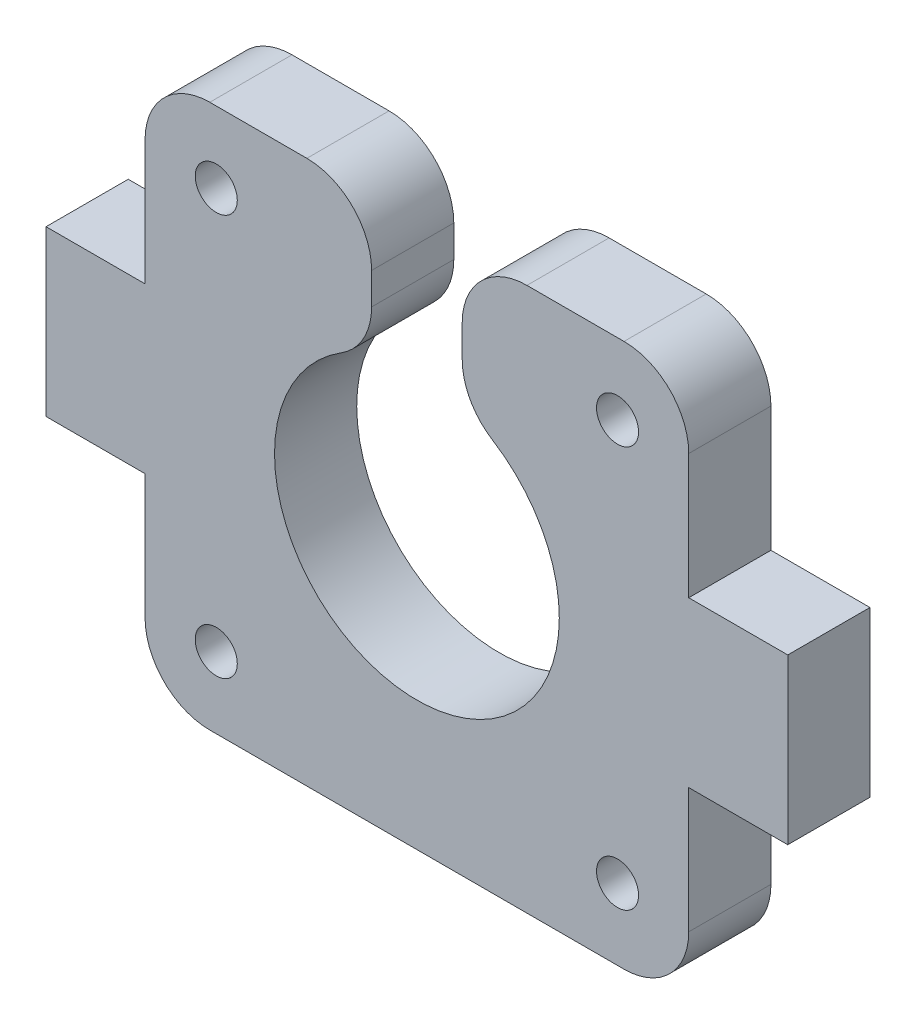
ISO-10303-21;
HEADER;
FILE_DESCRIPTION(('STEP AP214'),'2;1');
FILE_NAME('part.step','',(''),(''),'','','');
FILE_SCHEMA(('AUTOMOTIVE_DESIGN { 1 0 10303 214 1 1 1 1 }'));
ENDSEC;
DATA;
#1=APPLICATION_CONTEXT('core data for automotive mechanical design processes');
#2=APPLICATION_PROTOCOL_DEFINITION('international standard','automotive_design',2000,#1);
#3=PRODUCT_CONTEXT('',#1,'mechanical');
#4=PRODUCT('Part','Part','',(#3));
#5=PRODUCT_RELATED_PRODUCT_CATEGORY('part','',(#4));
#6=PRODUCT_DEFINITION_FORMATION('','',#4);
#7=PRODUCT_DEFINITION_CONTEXT('part definition',#1,'design');
#8=PRODUCT_DEFINITION('design','',#6,#7);
#9=PRODUCT_DEFINITION_SHAPE('','',#8);
#10=(LENGTH_UNIT() NAMED_UNIT(*) SI_UNIT(.MILLI.,.METRE.));
#11=(NAMED_UNIT(*) PLANE_ANGLE_UNIT() SI_UNIT($,.RADIAN.));
#12=(NAMED_UNIT(*) SI_UNIT($,.STERADIAN.) SOLID_ANGLE_UNIT());
#13=UNCERTAINTY_MEASURE_WITH_UNIT(LENGTH_MEASURE(1.E-05),#10,'distance_accuracy_value','');
#14=(GEOMETRIC_REPRESENTATION_CONTEXT(3) GLOBAL_UNCERTAINTY_ASSIGNED_CONTEXT((#13)) GLOBAL_UNIT_ASSIGNED_CONTEXT((#10,
#11,#12)) REPRESENTATION_CONTEXT('',''));
#15=CARTESIAN_POINT('',(0.,0.,0.));
#16=DIRECTION('',(0.,0.,1.));
#17=DIRECTION('',(1.,0.,0.));
#18=AXIS2_PLACEMENT_3D('',#15,#16,#17);
#19=CARTESIAN_POINT('',(0.,0.,6.35));
#20=DIRECTION('',(0.,0.,1.));
#21=DIRECTION('',(1.,0.,0.));
#22=AXIS2_PLACEMENT_3D('',#19,#20,#21);
#23=PLANE('',#22);
#24=CARTESIAN_POINT('',(15.5,15.5,6.35));
#25=DIRECTION('',(0.,0.,1.));
#26=DIRECTION('',(1.,0.,0.));
#27=AXIS2_PLACEMENT_3D('',#24,#25,#26);
#28=CIRCLE('',#27,1.625);
#29=CARTESIAN_POINT('',(17.125,15.5,6.35));
#30=VERTEX_POINT('',#29);
#31=EDGE_CURVE('E280',#30,#30,#28,.T.);
#32=ORIENTED_EDGE('',*,*,#31,.F.);
#33=EDGE_LOOP('',(#32));
#34=FACE_BOUND('',#33,.T.);
#35=CARTESIAN_POINT('',(15.5,-15.5,6.35));
#36=DIRECTION('',(0.,0.,1.));
#37=DIRECTION('',(1.,0.,0.));
#38=AXIS2_PLACEMENT_3D('',#35,#36,#37);
#39=CIRCLE('',#38,1.625);
#40=CARTESIAN_POINT('',(17.125,-15.5,6.35));
#41=VERTEX_POINT('',#40);
#42=EDGE_CURVE('E292',#41,#41,#39,.T.);
#43=ORIENTED_EDGE('',*,*,#42,.F.);
#44=EDGE_LOOP('',(#43));
#45=FACE_BOUND('',#44,.T.);
#46=CARTESIAN_POINT('',(-15.5,15.5,6.35));
#47=DIRECTION('',(0.,0.,1.));
#48=DIRECTION('',(1.,0.,0.));
#49=AXIS2_PLACEMENT_3D('',#46,#47,#48);
#50=CIRCLE('',#49,1.625);
#51=CARTESIAN_POINT('',(-13.875,15.5,6.35));
#52=VERTEX_POINT('',#51);
#53=EDGE_CURVE('E298',#52,#52,#50,.T.);
#54=ORIENTED_EDGE('',*,*,#53,.F.);
#55=EDGE_LOOP('',(#54));
#56=FACE_BOUND('',#55,.T.);
#57=CARTESIAN_POINT('',(-15.5,-15.5,6.35));
#58=DIRECTION('',(0.,0.,1.));
#59=DIRECTION('',(1.,0.,0.));
#60=AXIS2_PLACEMENT_3D('',#57,#58,#59);
#61=CIRCLE('',#60,1.625);
#62=CARTESIAN_POINT('',(-13.875,-15.5,6.35));
#63=VERTEX_POINT('',#62);
#64=EDGE_CURVE('E304',#63,#63,#61,.T.);
#65=ORIENTED_EDGE('',*,*,#64,.F.);
#66=EDGE_LOOP('',(#65));
#67=FACE_BOUND('',#66,.T.);
#68=DIRECTION('',(-1.,0.,0.));
#69=VECTOR('',#68,1.);
#70=CARTESIAN_POINT('',(28.65,21.,6.35));
#71=LINE('',#70,#69);
#72=CARTESIAN_POINT('',(16.,21.,6.35));
#73=VERTEX_POINT('',#72);
#74=CARTESIAN_POINT('',(8.5,21.,6.35));
#75=VERTEX_POINT('',#74);
#76=EDGE_CURVE('E324',#73,#75,#71,.T.);
#77=ORIENTED_EDGE('',*,*,#76,.T.);
#78=CARTESIAN_POINT('',(8.5,16.,6.35));
#79=DIRECTION('',(0.,0.,1.));
#80=DIRECTION('',(1.,0.,0.));
#81=AXIS2_PLACEMENT_3D('',#78,#79,#80);
#82=CIRCLE('',#81,5.);
#83=CARTESIAN_POINT('',(3.5,16.,6.35));
#84=VERTEX_POINT('',#83);
#85=EDGE_CURVE('E354',#75,#84,#82,.T.);
#86=ORIENTED_EDGE('',*,*,#85,.T.);
#87=DIRECTION('',(0.,1.,0.));
#88=VECTOR('',#87,1.);
#89=CARTESIAN_POINT('',(3.5,0.,6.35));
#90=LINE('',#89,#88);
#91=CARTESIAN_POINT('',(3.5,13.555441711726,6.35));
#92=VERTEX_POINT('',#91);
#93=EDGE_CURVE('E282',#92,#84,#90,.T.);
#94=ORIENTED_EDGE('',*,*,#93,.F.);
#95=CARTESIAN_POINT('',(8.5,13.555441711726,6.35));
#96=DIRECTION('',(0.,0.,1.));
#97=DIRECTION('',(1.,0.,0.));
#98=AXIS2_PLACEMENT_3D('',#95,#96,#97);
#99=CIRCLE('',#98,5.);
#100=CARTESIAN_POINT('',(5.84375,9.3193661768116,6.35));
#101=VERTEX_POINT('',#100);
#102=EDGE_CURVE('E348',#92,#101,#99,.T.);
#103=ORIENTED_EDGE('',*,*,#102,.T.);
#104=CARTESIAN_POINT('',(0.,0.,6.35));
#105=DIRECTION('',(0.,0.,1.));
#106=DIRECTION('',(1.,0.,0.));
#107=AXIS2_PLACEMENT_3D('',#104,#105,#106);
#108=CIRCLE('',#107,11.);
#109=CARTESIAN_POINT('',(-5.84375,9.3193661768116,6.35));
#110=VERTEX_POINT('',#109);
#111=EDGE_CURVE('E257',#110,#101,#108,.T.);
#112=ORIENTED_EDGE('',*,*,#111,.F.);
#113=CARTESIAN_POINT('',(-8.5,13.555441711726,6.35));
#114=DIRECTION('',(0.,0.,1.));
#115=DIRECTION('',(1.,0.,0.));
#116=AXIS2_PLACEMENT_3D('',#113,#114,#115);
#117=CIRCLE('',#116,5.);
#118=CARTESIAN_POINT('',(-3.5,13.555441711726,6.35));
#119=VERTEX_POINT('',#118);
#120=EDGE_CURVE('E350',#110,#119,#117,.T.);
#121=ORIENTED_EDGE('',*,*,#120,.T.);
#122=DIRECTION('',(0.,1.,0.));
#123=VECTOR('',#122,1.);
#124=CARTESIAN_POINT('',(-3.5,0.,6.35));
#125=LINE('',#124,#123);
#126=CARTESIAN_POINT('',(-3.5,16.,6.35));
#127=VERTEX_POINT('',#126);
#128=EDGE_CURVE('E275',#119,#127,#125,.T.);
#129=ORIENTED_EDGE('',*,*,#128,.T.);
#130=CARTESIAN_POINT('',(-8.5,16.,6.35));
#131=DIRECTION('',(0.,0.,1.));
#132=DIRECTION('',(1.,0.,0.));
#133=AXIS2_PLACEMENT_3D('',#130,#131,#132);
#134=CIRCLE('',#133,5.);
#135=CARTESIAN_POINT('',(-8.5,21.,6.35));
#136=VERTEX_POINT('',#135);
#137=EDGE_CURVE('E352',#127,#136,#134,.T.);
#138=ORIENTED_EDGE('',*,*,#137,.T.);
#139=CARTESIAN_POINT('',(-16.,21.,6.35));
#140=VERTEX_POINT('',#139);
#141=EDGE_CURVE('E321',#136,#140,#71,.T.);
#142=ORIENTED_EDGE('',*,*,#141,.T.);
#143=CARTESIAN_POINT('',(-16.,16.,6.35));
#144=DIRECTION('',(0.,0.,1.));
#145=DIRECTION('',(1.,0.,0.));
#146=AXIS2_PLACEMENT_3D('',#143,#144,#145);
#147=CIRCLE('',#146,5.);
#148=CARTESIAN_POINT('',(-21.,16.,6.35));
#149=VERTEX_POINT('',#148);
#150=EDGE_CURVE('E340',#140,#149,#147,.T.);
#151=ORIENTED_EDGE('',*,*,#150,.T.);
#152=DIRECTION('',(0.,1.,0.));
#153=VECTOR('',#152,1.);
#154=CARTESIAN_POINT('',(-21.,6.35,6.35));
#155=LINE('',#154,#153);
#156=CARTESIAN_POINT('',(-21.,6.35,6.35));
#157=VERTEX_POINT('',#156);
#158=EDGE_CURVE('E245',#157,#149,#155,.T.);
#159=ORIENTED_EDGE('',*,*,#158,.F.);
#160=DIRECTION('',(1.,0.,0.));
#161=VECTOR('',#160,1.);
#162=CARTESIAN_POINT('',(-21.,6.35,6.35));
#163=LINE('',#162,#161);
#164=CARTESIAN_POINT('',(-28.65,6.35,6.35));
#165=VERTEX_POINT('',#164);
#166=EDGE_CURVE('E249',#165,#157,#163,.T.);
#167=ORIENTED_EDGE('',*,*,#166,.F.);
#168=DIRECTION('',(0.,-1.,0.));
#169=VECTOR('',#168,1.);
#170=CARTESIAN_POINT('',(-28.65,-21.,6.35));
#171=LINE('',#170,#169);
#172=CARTESIAN_POINT('',(-28.65,-6.35,6.35));
#173=VERTEX_POINT('',#172);
#174=EDGE_CURVE('E311',#165,#173,#171,.T.);
#175=ORIENTED_EDGE('',*,*,#174,.T.);
#176=DIRECTION('',(-1.,0.,0.));
#177=VECTOR('',#176,1.);
#178=CARTESIAN_POINT('',(-28.65,-6.35,6.35));
#179=LINE('',#178,#177);
#180=CARTESIAN_POINT('',(-21.,-6.35,6.35));
#181=VERTEX_POINT('',#180);
#182=EDGE_CURVE('E262',#181,#173,#179,.T.);
#183=ORIENTED_EDGE('',*,*,#182,.F.);
#184=DIRECTION('',(0.,1.,0.));
#185=VECTOR('',#184,1.);
#186=CARTESIAN_POINT('',(-21.,-6.35,6.35));
#187=LINE('',#186,#185);
#188=CARTESIAN_POINT('',(-21.,-16.,6.35));
#189=VERTEX_POINT('',#188);
#190=EDGE_CURVE('E226',#189,#181,#187,.T.);
#191=ORIENTED_EDGE('',*,*,#190,.F.);
#192=CARTESIAN_POINT('',(-16.,-16.,6.35));
#193=DIRECTION('',(0.,0.,1.));
#194=DIRECTION('',(1.,0.,0.));
#195=AXIS2_PLACEMENT_3D('',#192,#193,#194);
#196=CIRCLE('',#195,5.);
#197=CARTESIAN_POINT('',(-16.,-21.,6.35));
#198=VERTEX_POINT('',#197);
#199=EDGE_CURVE('E346',#189,#198,#196,.T.);
#200=ORIENTED_EDGE('',*,*,#199,.T.);
#201=DIRECTION('',(1.,0.,0.));
#202=VECTOR('',#201,1.);
#203=CARTESIAN_POINT('',(28.65,-21.,6.35));
#204=LINE('',#203,#202);
#205=CARTESIAN_POINT('',(16.,-21.,6.35));
#206=VERTEX_POINT('',#205);
#207=EDGE_CURVE('E314',#198,#206,#204,.T.);
#208=ORIENTED_EDGE('',*,*,#207,.T.);
#209=CARTESIAN_POINT('',(16.,-16.,6.35));
#210=DIRECTION('',(0.,0.,1.));
#211=DIRECTION('',(1.,0.,0.));
#212=AXIS2_PLACEMENT_3D('',#209,#210,#211);
#213=CIRCLE('',#212,5.);
#214=CARTESIAN_POINT('',(21.,-16.,6.35));
#215=VERTEX_POINT('',#214);
#216=EDGE_CURVE('E344',#206,#215,#213,.T.);
#217=ORIENTED_EDGE('',*,*,#216,.T.);
#218=DIRECTION('',(0.,1.,0.));
#219=VECTOR('',#218,1.);
#220=CARTESIAN_POINT('',(21.,-6.35,6.35));
#221=LINE('',#220,#219);
#222=CARTESIAN_POINT('',(21.,-6.35,6.35));
#223=VERTEX_POINT('',#222);
#224=EDGE_CURVE('E234',#215,#223,#221,.T.);
#225=ORIENTED_EDGE('',*,*,#224,.T.);
#226=DIRECTION('',(1.,0.,0.));
#227=VECTOR('',#226,1.);
#228=CARTESIAN_POINT('',(28.65,-6.35,6.35));
#229=LINE('',#228,#227);
#230=CARTESIAN_POINT('',(28.65,-6.35,6.35));
#231=VERTEX_POINT('',#230);
#232=EDGE_CURVE('E231',#223,#231,#229,.T.);
#233=ORIENTED_EDGE('',*,*,#232,.T.);
#234=DIRECTION('',(0.,1.,0.));
#235=VECTOR('',#234,1.);
#236=CARTESIAN_POINT('',(28.65,-21.,6.35));
#237=LINE('',#236,#235);
#238=CARTESIAN_POINT('',(28.65,6.35,6.35));
#239=VERTEX_POINT('',#238);
#240=EDGE_CURVE('E318',#231,#239,#237,.T.);
#241=ORIENTED_EDGE('',*,*,#240,.T.);
#242=DIRECTION('',(-1.,0.,0.));
#243=VECTOR('',#242,1.);
#244=CARTESIAN_POINT('',(21.,6.35,6.35));
#245=LINE('',#244,#243);
#246=CARTESIAN_POINT('',(21.,6.35,6.35));
#247=VERTEX_POINT('',#246);
#248=EDGE_CURVE('E220',#239,#247,#245,.T.);
#249=ORIENTED_EDGE('',*,*,#248,.T.);
#250=DIRECTION('',(0.,1.,0.));
#251=VECTOR('',#250,1.);
#252=CARTESIAN_POINT('',(21.,6.35,6.35));
#253=LINE('',#252,#251);
#254=CARTESIAN_POINT('',(21.,16.,6.35));
#255=VERTEX_POINT('',#254);
#256=EDGE_CURVE('E215',#247,#255,#253,.T.);
#257=ORIENTED_EDGE('',*,*,#256,.T.);
#258=CARTESIAN_POINT('',(16.,16.,6.35));
#259=DIRECTION('',(0.,0.,1.));
#260=DIRECTION('',(1.,0.,0.));
#261=AXIS2_PLACEMENT_3D('',#258,#259,#260);
#262=CIRCLE('',#261,5.);
#263=EDGE_CURVE('E342',#255,#73,#262,.T.);
#264=ORIENTED_EDGE('',*,*,#263,.T.);
#265=EDGE_LOOP('',(#77,#86,#94,#103,#112,#121,#129,#138,#142,#151,#159,#167,#175,#183,#191,#200,
#208,#217,#225,#233,#241,#249,#257,#264));
#266=FACE_BOUND('',#265,.T.);
#267=ADVANCED_FACE('F36',(#34,#45,#56,#67,#266),#23,.T.);
#268=CARTESIAN_POINT('',(0.,0.,0.));
#269=DIRECTION('',(0.,0.,1.));
#270=DIRECTION('',(1.,0.,0.));
#271=AXIS2_PLACEMENT_3D('',#268,#269,#270);
#272=PLANE('',#271);
#273=CARTESIAN_POINT('',(-15.5,-15.5,0.));
#274=DIRECTION('',(0.,0.,1.));
#275=DIRECTION('',(1.,0.,0.));
#276=AXIS2_PLACEMENT_3D('',#273,#274,#275);
#277=CIRCLE('',#276,1.625);
#278=CARTESIAN_POINT('',(-13.875,-15.5,0.));
#279=VERTEX_POINT('',#278);
#280=EDGE_CURVE('E307',#279,#279,#277,.T.);
#281=ORIENTED_EDGE('',*,*,#280,.T.);
#282=EDGE_LOOP('',(#281));
#283=FACE_BOUND('',#282,.T.);
#284=CARTESIAN_POINT('',(-15.5,15.5,0.));
#285=DIRECTION('',(0.,0.,1.));
#286=DIRECTION('',(1.,0.,0.));
#287=AXIS2_PLACEMENT_3D('',#284,#285,#286);
#288=CIRCLE('',#287,1.625);
#289=CARTESIAN_POINT('',(-13.875,15.5,0.));
#290=VERTEX_POINT('',#289);
#291=EDGE_CURVE('E301',#290,#290,#288,.T.);
#292=ORIENTED_EDGE('',*,*,#291,.T.);
#293=EDGE_LOOP('',(#292));
#294=FACE_BOUND('',#293,.T.);
#295=CARTESIAN_POINT('',(15.5,-15.5,0.));
#296=DIRECTION('',(0.,0.,1.));
#297=DIRECTION('',(1.,0.,0.));
#298=AXIS2_PLACEMENT_3D('',#295,#296,#297);
#299=CIRCLE('',#298,1.625);
#300=CARTESIAN_POINT('',(17.125,-15.5,0.));
#301=VERTEX_POINT('',#300);
#302=EDGE_CURVE('E295',#301,#301,#299,.T.);
#303=ORIENTED_EDGE('',*,*,#302,.T.);
#304=EDGE_LOOP('',(#303));
#305=FACE_BOUND('',#304,.T.);
#306=CARTESIAN_POINT('',(15.5,15.5,0.));
#307=DIRECTION('',(0.,0.,1.));
#308=DIRECTION('',(1.,0.,0.));
#309=AXIS2_PLACEMENT_3D('',#306,#307,#308);
#310=CIRCLE('',#309,1.625);
#311=CARTESIAN_POINT('',(17.125,15.5,0.));
#312=VERTEX_POINT('',#311);
#313=EDGE_CURVE('E289',#312,#312,#310,.T.);
#314=ORIENTED_EDGE('',*,*,#313,.T.);
#315=EDGE_LOOP('',(#314));
#316=FACE_BOUND('',#315,.T.);
#317=DIRECTION('',(0.,1.,0.));
#318=VECTOR('',#317,1.);
#319=CARTESIAN_POINT('',(3.5,0.,0.));
#320=LINE('',#319,#318);
#321=CARTESIAN_POINT('',(3.5,13.555441711726,0.));
#322=VERTEX_POINT('',#321);
#323=CARTESIAN_POINT('',(3.5,16.,0.));
#324=VERTEX_POINT('',#323);
#325=EDGE_CURVE('E274',#322,#324,#320,.T.);
#326=ORIENTED_EDGE('',*,*,#325,.T.);
#327=CARTESIAN_POINT('',(8.5,16.,0.));
#328=DIRECTION('',(0.,0.,1.));
#329=DIRECTION('',(1.,0.,0.));
#330=AXIS2_PLACEMENT_3D('',#327,#328,#329);
#331=CIRCLE('',#330,5.);
#332=CARTESIAN_POINT('',(8.5,21.,0.));
#333=VERTEX_POINT('',#332);
#334=EDGE_CURVE('E374',#324,#333,#331,.F.);
#335=ORIENTED_EDGE('',*,*,#334,.T.);
#336=DIRECTION('',(-1.,0.,0.));
#337=VECTOR('',#336,1.);
#338=CARTESIAN_POINT('',(28.65,21.,0.));
#339=LINE('',#338,#337);
#340=CARTESIAN_POINT('',(16.,21.,0.));
#341=VERTEX_POINT('',#340);
#342=EDGE_CURVE('E315',#341,#333,#339,.T.);
#343=ORIENTED_EDGE('',*,*,#342,.F.);
#344=CARTESIAN_POINT('',(16.,16.,0.));
#345=DIRECTION('',(0.,0.,1.));
#346=DIRECTION('',(1.,0.,0.));
#347=AXIS2_PLACEMENT_3D('',#344,#345,#346);
#348=CIRCLE('',#347,5.);
#349=CARTESIAN_POINT('',(21.,16.,0.));
#350=VERTEX_POINT('',#349);
#351=EDGE_CURVE('E51',#341,#350,#348,.F.);
#352=ORIENTED_EDGE('',*,*,#351,.T.);
#353=DIRECTION('',(0.,1.,0.));
#354=VECTOR('',#353,1.);
#355=CARTESIAN_POINT('',(21.,6.35,0.));
#356=LINE('',#355,#354);
#357=CARTESIAN_POINT('',(21.,6.35,0.));
#358=VERTEX_POINT('',#357);
#359=EDGE_CURVE('E208',#358,#350,#356,.T.);
#360=ORIENTED_EDGE('',*,*,#359,.F.);
#361=DIRECTION('',(-1.,0.,0.));
#362=VECTOR('',#361,1.);
#363=CARTESIAN_POINT('',(21.,6.35,0.));
#364=LINE('',#363,#362);
#365=CARTESIAN_POINT('',(28.65,6.35,0.));
#366=VERTEX_POINT('',#365);
#367=EDGE_CURVE('E199',#366,#358,#364,.T.);
#368=ORIENTED_EDGE('',*,*,#367,.F.);
#369=DIRECTION('',(0.,1.,0.));
#370=VECTOR('',#369,1.);
#371=CARTESIAN_POINT('',(28.65,-21.,0.));
#372=LINE('',#371,#370);
#373=CARTESIAN_POINT('',(28.65,-6.35,0.));
#374=VERTEX_POINT('',#373);
#375=EDGE_CURVE('E330',#374,#366,#372,.T.);
#376=ORIENTED_EDGE('',*,*,#375,.F.);
#377=DIRECTION('',(1.,0.,0.));
#378=VECTOR('',#377,1.);
#379=CARTESIAN_POINT('',(28.65,-6.35,0.));
#380=LINE('',#379,#378);
#381=CARTESIAN_POINT('',(21.,-6.35,0.));
#382=VERTEX_POINT('',#381);
#383=EDGE_CURVE('E230',#382,#374,#380,.T.);
#384=ORIENTED_EDGE('',*,*,#383,.F.);
#385=DIRECTION('',(0.,1.,0.));
#386=VECTOR('',#385,1.);
#387=CARTESIAN_POINT('',(21.,-6.35,0.));
#388=LINE('',#387,#386);
#389=CARTESIAN_POINT('',(21.,-16.,0.));
#390=VERTEX_POINT('',#389);
#391=EDGE_CURVE('E228',#390,#382,#388,.T.);
#392=ORIENTED_EDGE('',*,*,#391,.F.);
#393=CARTESIAN_POINT('',(16.,-16.,0.));
#394=DIRECTION('',(0.,0.,1.));
#395=DIRECTION('',(1.,0.,0.));
#396=AXIS2_PLACEMENT_3D('',#393,#394,#395);
#397=CIRCLE('',#396,5.);
#398=CARTESIAN_POINT('',(16.,-21.,0.));
#399=VERTEX_POINT('',#398);
#400=EDGE_CURVE('E364',#390,#399,#397,.F.);
#401=ORIENTED_EDGE('',*,*,#400,.T.);
#402=DIRECTION('',(1.,0.,0.));
#403=VECTOR('',#402,1.);
#404=CARTESIAN_POINT('',(28.65,-21.,0.));
#405=LINE('',#404,#403);
#406=CARTESIAN_POINT('',(-16.,-21.,0.));
#407=VERTEX_POINT('',#406);
#408=EDGE_CURVE('E327',#407,#399,#405,.T.);
#409=ORIENTED_EDGE('',*,*,#408,.F.);
#410=CARTESIAN_POINT('',(-16.,-16.,0.));
#411=DIRECTION('',(0.,0.,1.));
#412=DIRECTION('',(1.,0.,0.));
#413=AXIS2_PLACEMENT_3D('',#410,#411,#412);
#414=CIRCLE('',#413,5.);
#415=CARTESIAN_POINT('',(-21.,-16.,0.));
#416=VERTEX_POINT('',#415);
#417=EDGE_CURVE('E366',#407,#416,#414,.F.);
#418=ORIENTED_EDGE('',*,*,#417,.T.);
#419=DIRECTION('',(0.,1.,0.));
#420=VECTOR('',#419,1.);
#421=CARTESIAN_POINT('',(-21.,-6.35,0.));
#422=LINE('',#421,#420);
#423=CARTESIAN_POINT('',(-21.,-6.35,0.));
#424=VERTEX_POINT('',#423);
#425=EDGE_CURVE('E259',#416,#424,#422,.T.);
#426=ORIENTED_EDGE('',*,*,#425,.T.);
#427=DIRECTION('',(-1.,0.,0.));
#428=VECTOR('',#427,1.);
#429=CARTESIAN_POINT('',(-28.65,-6.35,0.));
#430=LINE('',#429,#428);
#431=CARTESIAN_POINT('',(-28.65,-6.35,0.));
#432=VERTEX_POINT('',#431);
#433=EDGE_CURVE('E261',#424,#432,#430,.T.);
#434=ORIENTED_EDGE('',*,*,#433,.T.);
#435=DIRECTION('',(0.,-1.,0.));
#436=VECTOR('',#435,1.);
#437=CARTESIAN_POINT('',(-28.65,-21.,0.));
#438=LINE('',#437,#436);
#439=CARTESIAN_POINT('',(-28.65,6.35,0.));
#440=VERTEX_POINT('',#439);
#441=EDGE_CURVE('E310',#440,#432,#438,.T.);
#442=ORIENTED_EDGE('',*,*,#441,.F.);
#443=DIRECTION('',(1.,0.,0.));
#444=VECTOR('',#443,1.);
#445=CARTESIAN_POINT('',(-21.,6.35,0.));
#446=LINE('',#445,#444);
#447=CARTESIAN_POINT('',(-21.,6.35,0.));
#448=VERTEX_POINT('',#447);
#449=EDGE_CURVE('E241',#440,#448,#446,.T.);
#450=ORIENTED_EDGE('',*,*,#449,.T.);
#451=DIRECTION('',(0.,1.,0.));
#452=VECTOR('',#451,1.);
#453=CARTESIAN_POINT('',(-21.,6.35,0.));
#454=LINE('',#453,#452);
#455=CARTESIAN_POINT('',(-21.,16.,0.));
#456=VERTEX_POINT('',#455);
#457=EDGE_CURVE('E244',#448,#456,#454,.T.);
#458=ORIENTED_EDGE('',*,*,#457,.T.);
#459=CARTESIAN_POINT('',(-16.,16.,0.));
#460=DIRECTION('',(0.,0.,1.));
#461=DIRECTION('',(1.,0.,0.));
#462=AXIS2_PLACEMENT_3D('',#459,#460,#461);
#463=CIRCLE('',#462,5.);
#464=CARTESIAN_POINT('',(-16.,21.,0.));
#465=VERTEX_POINT('',#464);
#466=EDGE_CURVE('E361',#456,#465,#463,.F.);
#467=ORIENTED_EDGE('',*,*,#466,.T.);
#468=CARTESIAN_POINT('',(-8.5,21.,0.));
#469=VERTEX_POINT('',#468);
#470=EDGE_CURVE('E332',#469,#465,#339,.T.);
#471=ORIENTED_EDGE('',*,*,#470,.F.);
#472=CARTESIAN_POINT('',(-8.5,16.,0.));
#473=DIRECTION('',(0.,0.,1.));
#474=DIRECTION('',(1.,0.,0.));
#475=AXIS2_PLACEMENT_3D('',#472,#473,#474);
#476=CIRCLE('',#475,5.);
#477=CARTESIAN_POINT('',(-3.5,16.,0.));
#478=VERTEX_POINT('',#477);
#479=EDGE_CURVE('E372',#469,#478,#476,.F.);
#480=ORIENTED_EDGE('',*,*,#479,.T.);
#481=DIRECTION('',(0.,1.,0.));
#482=VECTOR('',#481,1.);
#483=CARTESIAN_POINT('',(-3.5,0.,0.));
#484=LINE('',#483,#482);
#485=CARTESIAN_POINT('',(-3.5,13.555441711726,0.));
#486=VERTEX_POINT('',#485);
#487=EDGE_CURVE('E277',#486,#478,#484,.T.);
#488=ORIENTED_EDGE('',*,*,#487,.F.);
#489=CARTESIAN_POINT('',(-8.5,13.555441711726,0.));
#490=DIRECTION('',(0.,0.,1.));
#491=DIRECTION('',(1.,0.,0.));
#492=AXIS2_PLACEMENT_3D('',#489,#490,#491);
#493=CIRCLE('',#492,5.);
#494=CARTESIAN_POINT('',(-5.84375,9.3193661768116,0.));
#495=VERTEX_POINT('',#494);
#496=EDGE_CURVE('E370',#486,#495,#493,.F.);
#497=ORIENTED_EDGE('',*,*,#496,.T.);
#498=CARTESIAN_POINT('',(0.,0.,0.));
#499=DIRECTION('',(0.,0.,1.));
#500=DIRECTION('',(1.,0.,0.));
#501=AXIS2_PLACEMENT_3D('',#498,#499,#500);
#502=CIRCLE('',#501,11.);
#503=CARTESIAN_POINT('',(5.84375,9.3193661768116,0.));
#504=VERTEX_POINT('',#503);
#505=EDGE_CURVE('E272',#495,#504,#502,.T.);
#506=ORIENTED_EDGE('',*,*,#505,.T.);
#507=CARTESIAN_POINT('',(8.5,13.555441711726,0.));
#508=DIRECTION('',(0.,0.,1.));
#509=DIRECTION('',(1.,0.,0.));
#510=AXIS2_PLACEMENT_3D('',#507,#508,#509);
#511=CIRCLE('',#510,5.);
#512=EDGE_CURVE('E368',#504,#322,#511,.F.);
#513=ORIENTED_EDGE('',*,*,#512,.T.);
#514=EDGE_LOOP('',(#326,#335,#343,#352,#360,#368,#376,#384,#392,#401,#409,#418,#426,#434,#442,
#450,#458,#467,#471,#480,#488,#497,#506,#513));
#515=FACE_BOUND('',#514,.T.);
#516=ADVANCED_FACE('F219',(#283,#294,#305,#316,#515),#272,.F.);
#517=CARTESIAN_POINT('',(28.65,-21.,6.35));
#518=DIRECTION('',(0.,1.,0.));
#519=DIRECTION('',(0.,0.,1.));
#520=AXIS2_PLACEMENT_3D('',#517,#518,#519);
#521=PLANE('',#520);
#522=ORIENTED_EDGE('',*,*,#207,.F.);
#523=DIRECTION('',(0.,0.,1.));
#524=VECTOR('',#523,1.);
#525=CARTESIAN_POINT('',(-16.,-21.,6.35));
#526=LINE('',#525,#524);
#527=EDGE_CURVE('E396',#198,#407,#526,.F.);
#528=ORIENTED_EDGE('',*,*,#527,.T.);
#529=ORIENTED_EDGE('',*,*,#408,.T.);
#530=DIRECTION('',(0.,0.,1.));
#531=VECTOR('',#530,1.);
#532=CARTESIAN_POINT('',(16.,-21.,6.35));
#533=LINE('',#532,#531);
#534=EDGE_CURVE('E393',#399,#206,#533,.T.);
#535=ORIENTED_EDGE('',*,*,#534,.T.);
#536=EDGE_LOOP('',(#522,#528,#529,#535));
#537=FACE_BOUND('',#536,.T.);
#538=ADVANCED_FACE('F425',(#537),#521,.F.);
#539=CARTESIAN_POINT('',(28.65,-21.,6.35));
#540=DIRECTION('',(-1.,0.,0.));
#541=DIRECTION('',(0.,0.,1.));
#542=AXIS2_PLACEMENT_3D('',#539,#540,#541);
#543=PLANE('',#542);
#544=DIRECTION('',(0.,0.,1.));
#545=VECTOR('',#544,1.);
#546=CARTESIAN_POINT('',(28.65,6.35,0.));
#547=LINE('',#546,#545);
#548=EDGE_CURVE('E205',#366,#239,#547,.T.);
#549=ORIENTED_EDGE('',*,*,#548,.T.);
#550=ORIENTED_EDGE('',*,*,#240,.F.);
#551=DIRECTION('',(0.,0.,1.));
#552=VECTOR('',#551,1.);
#553=CARTESIAN_POINT('',(28.65,-6.35,0.));
#554=LINE('',#553,#552);
#555=EDGE_CURVE('E233',#374,#231,#554,.T.);
#556=ORIENTED_EDGE('',*,*,#555,.F.);
#557=ORIENTED_EDGE('',*,*,#375,.T.);
#558=EDGE_LOOP('',(#549,#550,#556,#557));
#559=FACE_BOUND('',#558,.T.);
#560=ADVANCED_FACE('F405',(#559),#543,.F.);
#561=CARTESIAN_POINT('',(28.65,21.,6.35));
#562=DIRECTION('',(0.,-1.,0.));
#563=DIRECTION('',(1.,0.,0.));
#564=AXIS2_PLACEMENT_3D('',#561,#562,#563);
#565=PLANE('',#564);
#566=ORIENTED_EDGE('',*,*,#342,.T.);
#567=DIRECTION('',(0.,0.,1.));
#568=VECTOR('',#567,1.);
#569=CARTESIAN_POINT('',(8.5,21.,6.35));
#570=LINE('',#569,#568);
#571=EDGE_CURVE('E337',#333,#75,#570,.T.);
#572=ORIENTED_EDGE('',*,*,#571,.T.);
#573=ORIENTED_EDGE('',*,*,#76,.F.);
#574=DIRECTION('',(0.,0.,1.));
#575=VECTOR('',#574,1.);
#576=CARTESIAN_POINT('',(16.,21.,0.));
#577=LINE('',#576,#575);
#578=EDGE_CURVE('E335',#73,#341,#577,.F.);
#579=ORIENTED_EDGE('',*,*,#578,.T.);
#580=EDGE_LOOP('',(#566,#572,#573,#579));
#581=FACE_BOUND('',#580,.T.);
#582=ADVANCED_FACE('F490',(#581),#565,.F.);
#583=ORIENTED_EDGE('',*,*,#141,.F.);
#584=DIRECTION('',(0.,0.,1.));
#585=VECTOR('',#584,1.);
#586=CARTESIAN_POINT('',(-8.5,21.,0.));
#587=LINE('',#586,#585);
#588=EDGE_CURVE('E384',#136,#469,#587,.F.);
#589=ORIENTED_EDGE('',*,*,#588,.T.);
#590=ORIENTED_EDGE('',*,*,#470,.T.);
#591=DIRECTION('',(0.,0.,1.));
#592=VECTOR('',#591,1.);
#593=CARTESIAN_POINT('',(-16.,21.,6.35));
#594=LINE('',#593,#592);
#595=EDGE_CURVE('E381',#465,#140,#594,.T.);
#596=ORIENTED_EDGE('',*,*,#595,.T.);
#597=EDGE_LOOP('',(#583,#589,#590,#596));
#598=FACE_BOUND('',#597,.T.);
#599=ADVANCED_FACE('F459',(#598),#565,.F.);
#600=CARTESIAN_POINT('',(-28.65,-21.,6.35));
#601=DIRECTION('',(1.,0.,0.));
#602=DIRECTION('',(0.,0.,-1.));
#603=AXIS2_PLACEMENT_3D('',#600,#601,#602);
#604=PLANE('',#603);
#605=ORIENTED_EDGE('',*,*,#174,.F.);
#606=DIRECTION('',(0.,0.,1.));
#607=VECTOR('',#606,1.);
#608=CARTESIAN_POINT('',(-28.65,6.35,0.));
#609=LINE('',#608,#607);
#610=EDGE_CURVE('E248',#440,#165,#609,.T.);
#611=ORIENTED_EDGE('',*,*,#610,.F.);
#612=ORIENTED_EDGE('',*,*,#441,.T.);
#613=DIRECTION('',(0.,0.,1.));
#614=VECTOR('',#613,1.);
#615=CARTESIAN_POINT('',(-28.65,-6.35,0.));
#616=LINE('',#615,#614);
#617=EDGE_CURVE('E252',#432,#173,#616,.T.);
#618=ORIENTED_EDGE('',*,*,#617,.T.);
#619=EDGE_LOOP('',(#605,#611,#612,#618));
#620=FACE_BOUND('',#619,.T.);
#621=ADVANCED_FACE('F443',(#620),#604,.F.);
#622=CARTESIAN_POINT('',(-15.5,-15.5,6.35));
#623=DIRECTION('',(0.,0.,1.));
#624=DIRECTION('',(1.,0.,0.));
#625=AXIS2_PLACEMENT_3D('',#622,#623,#624);
#626=CYLINDRICAL_SURFACE('',#625,1.625);
#627=ORIENTED_EDGE('',*,*,#280,.F.);
#628=EDGE_LOOP('',(#627));
#629=FACE_BOUND('',#628,.T.);
#630=ORIENTED_EDGE('',*,*,#64,.T.);
#631=EDGE_LOOP('',(#630));
#632=FACE_BOUND('',#631,.T.);
#633=ADVANCED_FACE('F510',(#629,#632),#626,.F.);
#634=CARTESIAN_POINT('',(-15.5,15.5,6.35));
#635=DIRECTION('',(0.,0.,1.));
#636=DIRECTION('',(1.,0.,0.));
#637=AXIS2_PLACEMENT_3D('',#634,#635,#636);
#638=CYLINDRICAL_SURFACE('',#637,1.625);
#639=ORIENTED_EDGE('',*,*,#291,.F.);
#640=EDGE_LOOP('',(#639));
#641=FACE_BOUND('',#640,.T.);
#642=ORIENTED_EDGE('',*,*,#53,.T.);
#643=EDGE_LOOP('',(#642));
#644=FACE_BOUND('',#643,.T.);
#645=ADVANCED_FACE('F697',(#641,#644),#638,.F.);
#646=CARTESIAN_POINT('',(15.5,-15.5,6.35));
#647=DIRECTION('',(0.,0.,1.));
#648=DIRECTION('',(1.,0.,0.));
#649=AXIS2_PLACEMENT_3D('',#646,#647,#648);
#650=CYLINDRICAL_SURFACE('',#649,1.625);
#651=ORIENTED_EDGE('',*,*,#302,.F.);
#652=EDGE_LOOP('',(#651));
#653=FACE_BOUND('',#652,.T.);
#654=ORIENTED_EDGE('',*,*,#42,.T.);
#655=EDGE_LOOP('',(#654));
#656=FACE_BOUND('',#655,.T.);
#657=ADVANCED_FACE('F688',(#653,#656),#650,.F.);
#658=CARTESIAN_POINT('',(15.5,15.5,6.35));
#659=DIRECTION('',(0.,0.,1.));
#660=DIRECTION('',(1.,0.,0.));
#661=AXIS2_PLACEMENT_3D('',#658,#659,#660);
#662=CYLINDRICAL_SURFACE('',#661,1.625);
#663=ORIENTED_EDGE('',*,*,#313,.F.);
#664=EDGE_LOOP('',(#663));
#665=FACE_BOUND('',#664,.T.);
#666=ORIENTED_EDGE('',*,*,#31,.T.);
#667=EDGE_LOOP('',(#666));
#668=FACE_BOUND('',#667,.T.);
#669=ADVANCED_FACE('F675',(#665,#668),#662,.F.);
#670=CARTESIAN_POINT('',(0.,0.,0.));
#671=DIRECTION('',(0.,0.,1.));
#672=DIRECTION('',(1.,0.,0.));
#673=AXIS2_PLACEMENT_3D('',#670,#671,#672);
#674=CYLINDRICAL_SURFACE('',#673,11.);
#675=ORIENTED_EDGE('',*,*,#505,.F.);
#676=DIRECTION('',(0.,0.,1.));
#677=VECTOR('',#676,1.);
#678=CARTESIAN_POINT('',(-5.84375,9.3193661768116,0.));
#679=LINE('',#678,#677);
#680=EDGE_CURVE('E387',#495,#110,#679,.T.);
#681=ORIENTED_EDGE('',*,*,#680,.T.);
#682=ORIENTED_EDGE('',*,*,#111,.T.);
#683=DIRECTION('',(0.,0.,1.));
#684=VECTOR('',#683,1.);
#685=CARTESIAN_POINT('',(5.84375,9.3193661768116,0.));
#686=LINE('',#685,#684);
#687=EDGE_CURVE('E59',#101,#504,#686,.F.);
#688=ORIENTED_EDGE('',*,*,#687,.T.);
#689=EDGE_LOOP('',(#675,#681,#682,#688));
#690=FACE_BOUND('',#689,.T.);
#691=ADVANCED_FACE('F474',(#690),#674,.F.);
#692=CARTESIAN_POINT('',(-3.5,0.,0.));
#693=DIRECTION('',(1.,0.,0.));
#694=DIRECTION('',(0.,0.,-1.));
#695=AXIS2_PLACEMENT_3D('',#692,#693,#694);
#696=PLANE('',#695);
#697=ORIENTED_EDGE('',*,*,#487,.T.);
#698=DIRECTION('',(0.,0.,1.));
#699=VECTOR('',#698,1.);
#700=CARTESIAN_POINT('',(-3.5,16.,6.35));
#701=LINE('',#700,#699);
#702=EDGE_CURVE('E378',#478,#127,#701,.T.);
#703=ORIENTED_EDGE('',*,*,#702,.T.);
#704=ORIENTED_EDGE('',*,*,#128,.F.);
#705=DIRECTION('',(0.,0.,-1.));
#706=VECTOR('',#705,1.);
#707=CARTESIAN_POINT('',(-3.5,13.555441711726,0.));
#708=LINE('',#707,#706);
#709=EDGE_CURVE('E376',#119,#486,#708,.T.);
#710=ORIENTED_EDGE('',*,*,#709,.T.);
#711=EDGE_LOOP('',(#697,#703,#704,#710));
#712=FACE_BOUND('',#711,.T.);
#713=ADVANCED_FACE('F467',(#712),#696,.T.);
#714=CARTESIAN_POINT('',(3.5,0.,0.));
#715=DIRECTION('',(1.,0.,0.));
#716=DIRECTION('',(0.,0.,-1.));
#717=AXIS2_PLACEMENT_3D('',#714,#715,#716);
#718=PLANE('',#717);
#719=ORIENTED_EDGE('',*,*,#93,.T.);
#720=DIRECTION('',(0.,0.,1.));
#721=VECTOR('',#720,1.);
#722=CARTESIAN_POINT('',(3.5,16.,0.));
#723=LINE('',#722,#721);
#724=EDGE_CURVE('E359',#84,#324,#723,.F.);
#725=ORIENTED_EDGE('',*,*,#724,.T.);
#726=ORIENTED_EDGE('',*,*,#325,.F.);
#727=DIRECTION('',(0.,0.,1.));
#728=VECTOR('',#727,1.);
#729=CARTESIAN_POINT('',(3.5,13.555441711726,0.));
#730=LINE('',#729,#728);
#731=EDGE_CURVE('E356',#322,#92,#730,.T.);
#732=ORIENTED_EDGE('',*,*,#731,.T.);
#733=EDGE_LOOP('',(#719,#725,#726,#732));
#734=FACE_BOUND('',#733,.T.);
#735=ADVANCED_FACE('F482',(#734),#718,.F.);
#736=CARTESIAN_POINT('',(-21.,-6.35,0.));
#737=DIRECTION('',(1.,0.,0.));
#738=DIRECTION('',(0.,1.,0.));
#739=AXIS2_PLACEMENT_3D('',#736,#737,#738);
#740=PLANE('',#739);
#741=ORIENTED_EDGE('',*,*,#425,.F.);
#742=DIRECTION('',(0.,0.,1.));
#743=VECTOR('',#742,1.);
#744=CARTESIAN_POINT('',(-21.,-16.,0.));
#745=LINE('',#744,#743);
#746=EDGE_CURVE('E390',#416,#189,#745,.T.);
#747=ORIENTED_EDGE('',*,*,#746,.T.);
#748=ORIENTED_EDGE('',*,*,#190,.T.);
#749=DIRECTION('',(0.,0.,1.));
#750=VECTOR('',#749,1.);
#751=CARTESIAN_POINT('',(-21.,-6.35,0.));
#752=LINE('',#751,#750);
#753=EDGE_CURVE('E265',#424,#181,#752,.T.);
#754=ORIENTED_EDGE('',*,*,#753,.F.);
#755=EDGE_LOOP('',(#741,#747,#748,#754));
#756=FACE_BOUND('',#755,.T.);
#757=ADVANCED_FACE('F433',(#756),#740,.F.);
#758=CARTESIAN_POINT('',(-28.65,-6.35,0.));
#759=DIRECTION('',(0.,1.,0.));
#760=DIRECTION('',(0.,0.,1.));
#761=AXIS2_PLACEMENT_3D('',#758,#759,#760);
#762=PLANE('',#761);
#763=ORIENTED_EDGE('',*,*,#182,.T.);
#764=ORIENTED_EDGE('',*,*,#617,.F.);
#765=ORIENTED_EDGE('',*,*,#433,.F.);
#766=ORIENTED_EDGE('',*,*,#753,.T.);
#767=EDGE_LOOP('',(#763,#764,#765,#766));
#768=FACE_BOUND('',#767,.T.);
#769=ADVANCED_FACE('F438',(#768),#762,.F.);
#770=CARTESIAN_POINT('',(-21.,6.35,0.));
#771=DIRECTION('',(1.,0.,0.));
#772=DIRECTION('',(0.,0.,-1.));
#773=AXIS2_PLACEMENT_3D('',#770,#771,#772);
#774=PLANE('',#773);
#775=ORIENTED_EDGE('',*,*,#158,.T.);
#776=DIRECTION('',(0.,0.,1.));
#777=VECTOR('',#776,1.);
#778=CARTESIAN_POINT('',(-21.,16.,0.));
#779=LINE('',#778,#777);
#780=EDGE_CURVE('E11',#149,#456,#779,.F.);
#781=ORIENTED_EDGE('',*,*,#780,.T.);
#782=ORIENTED_EDGE('',*,*,#457,.F.);
#783=DIRECTION('',(0.,0.,1.));
#784=VECTOR('',#783,1.);
#785=CARTESIAN_POINT('',(-21.,6.35,0.));
#786=LINE('',#785,#784);
#787=EDGE_CURVE('E255',#448,#157,#786,.T.);
#788=ORIENTED_EDGE('',*,*,#787,.T.);
#789=EDGE_LOOP('',(#775,#781,#782,#788));
#790=FACE_BOUND('',#789,.T.);
#791=ADVANCED_FACE('F450',(#790),#774,.F.);
#792=CARTESIAN_POINT('',(-21.,6.35,0.));
#793=DIRECTION('',(0.,-1.,0.));
#794=DIRECTION('',(0.,0.,-1.));
#795=AXIS2_PLACEMENT_3D('',#792,#793,#794);
#796=PLANE('',#795);
#797=ORIENTED_EDGE('',*,*,#166,.T.);
#798=ORIENTED_EDGE('',*,*,#787,.F.);
#799=ORIENTED_EDGE('',*,*,#449,.F.);
#800=ORIENTED_EDGE('',*,*,#610,.T.);
#801=EDGE_LOOP('',(#797,#798,#799,#800));
#802=FACE_BOUND('',#801,.T.);
#803=ADVANCED_FACE('F446',(#802),#796,.F.);
#804=CARTESIAN_POINT('',(21.,6.35,0.));
#805=DIRECTION('',(0.,1.,0.));
#806=DIRECTION('',(0.,0.,1.));
#807=AXIS2_PLACEMENT_3D('',#804,#805,#806);
#808=PLANE('',#807);
#809=ORIENTED_EDGE('',*,*,#248,.F.);
#810=ORIENTED_EDGE('',*,*,#548,.F.);
#811=ORIENTED_EDGE('',*,*,#367,.T.);
#812=DIRECTION('',(0.,0.,1.));
#813=VECTOR('',#812,1.);
#814=CARTESIAN_POINT('',(21.,6.35,0.));
#815=LINE('',#814,#813);
#816=EDGE_CURVE('E202',#358,#247,#815,.T.);
#817=ORIENTED_EDGE('',*,*,#816,.T.);
#818=EDGE_LOOP('',(#809,#810,#811,#817));
#819=FACE_BOUND('',#818,.T.);
#820=ADVANCED_FACE('F201',(#819),#808,.T.);
#821=CARTESIAN_POINT('',(21.,6.35,0.));
#822=DIRECTION('',(1.,0.,0.));
#823=DIRECTION('',(0.,0.,-1.));
#824=AXIS2_PLACEMENT_3D('',#821,#822,#823);
#825=PLANE('',#824);
#826=ORIENTED_EDGE('',*,*,#359,.T.);
#827=DIRECTION('',(0.,0.,1.));
#828=VECTOR('',#827,1.);
#829=CARTESIAN_POINT('',(21.,16.,6.35));
#830=LINE('',#829,#828);
#831=EDGE_CURVE('E44',#350,#255,#830,.T.);
#832=ORIENTED_EDGE('',*,*,#831,.T.);
#833=ORIENTED_EDGE('',*,*,#256,.F.);
#834=ORIENTED_EDGE('',*,*,#816,.F.);
#835=EDGE_LOOP('',(#826,#832,#833,#834));
#836=FACE_BOUND('',#835,.T.);
#837=ADVANCED_FACE('F211',(#836),#825,.T.);
#838=CARTESIAN_POINT('',(21.,-6.35,0.));
#839=DIRECTION('',(1.,0.,0.));
#840=DIRECTION('',(0.,1.,0.));
#841=AXIS2_PLACEMENT_3D('',#838,#839,#840);
#842=PLANE('',#841);
#843=ORIENTED_EDGE('',*,*,#224,.F.);
#844=DIRECTION('',(0.,0.,1.));
#845=VECTOR('',#844,1.);
#846=CARTESIAN_POINT('',(21.,-16.,0.));
#847=LINE('',#846,#845);
#848=EDGE_CURVE('E398',#215,#390,#847,.F.);
#849=ORIENTED_EDGE('',*,*,#848,.T.);
#850=ORIENTED_EDGE('',*,*,#391,.T.);
#851=DIRECTION('',(0.,0.,1.));
#852=VECTOR('',#851,1.);
#853=CARTESIAN_POINT('',(21.,-6.35,0.));
#854=LINE('',#853,#852);
#855=EDGE_CURVE('E224',#382,#223,#854,.T.);
#856=ORIENTED_EDGE('',*,*,#855,.T.);
#857=EDGE_LOOP('',(#843,#849,#850,#856));
#858=FACE_BOUND('',#857,.T.);
#859=ADVANCED_FACE('F416',(#858),#842,.T.);
#860=CARTESIAN_POINT('',(28.65,-6.35,0.));
#861=DIRECTION('',(0.,-1.,0.));
#862=DIRECTION('',(0.,0.,-1.));
#863=AXIS2_PLACEMENT_3D('',#860,#861,#862);
#864=PLANE('',#863);
#865=ORIENTED_EDGE('',*,*,#232,.F.);
#866=ORIENTED_EDGE('',*,*,#855,.F.);
#867=ORIENTED_EDGE('',*,*,#383,.T.);
#868=ORIENTED_EDGE('',*,*,#555,.T.);
#869=EDGE_LOOP('',(#865,#866,#867,#868));
#870=FACE_BOUND('',#869,.T.);
#871=ADVANCED_FACE('F413',(#870),#864,.T.);
#872=CARTESIAN_POINT('',(8.5,16.,6.35));
#873=DIRECTION('',(0.,0.,1.));
#874=DIRECTION('',(1.,0.,0.));
#875=AXIS2_PLACEMENT_3D('',#872,#873,#874);
#876=CYLINDRICAL_SURFACE('',#875,5.);
#877=ORIENTED_EDGE('',*,*,#334,.F.);
#878=ORIENTED_EDGE('',*,*,#724,.F.);
#879=ORIENTED_EDGE('',*,*,#85,.F.);
#880=ORIENTED_EDGE('',*,*,#571,.F.);
#881=EDGE_LOOP('',(#877,#878,#879,#880));
#882=FACE_BOUND('',#881,.T.);
#883=ADVANCED_FACE('F488',(#882),#876,.T.);
#884=CARTESIAN_POINT('',(-8.5,16.,0.));
#885=DIRECTION('',(0.,0.,-1.));
#886=DIRECTION('',(-1.,0.,0.));
#887=AXIS2_PLACEMENT_3D('',#884,#885,#886);
#888=CYLINDRICAL_SURFACE('',#887,5.);
#889=ORIENTED_EDGE('',*,*,#479,.F.);
#890=ORIENTED_EDGE('',*,*,#588,.F.);
#891=ORIENTED_EDGE('',*,*,#137,.F.);
#892=ORIENTED_EDGE('',*,*,#702,.F.);
#893=EDGE_LOOP('',(#889,#890,#891,#892));
#894=FACE_BOUND('',#893,.T.);
#895=ADVANCED_FACE('F462',(#894),#888,.T.);
#896=CARTESIAN_POINT('',(-8.5,13.555441711726,0.));
#897=DIRECTION('',(0.,0.,1.));
#898=DIRECTION('',(1.,0.,0.));
#899=AXIS2_PLACEMENT_3D('',#896,#897,#898);
#900=CYLINDRICAL_SURFACE('',#899,5.);
#901=ORIENTED_EDGE('',*,*,#496,.F.);
#902=ORIENTED_EDGE('',*,*,#709,.F.);
#903=ORIENTED_EDGE('',*,*,#120,.F.);
#904=ORIENTED_EDGE('',*,*,#680,.F.);
#905=EDGE_LOOP('',(#901,#902,#903,#904));
#906=FACE_BOUND('',#905,.T.);
#907=ADVANCED_FACE('F471',(#906),#900,.T.);
#908=CARTESIAN_POINT('',(8.5,13.555441711726,0.));
#909=DIRECTION('',(0.,0.,1.));
#910=DIRECTION('',(1.,0.,0.));
#911=AXIS2_PLACEMENT_3D('',#908,#909,#910);
#912=CYLINDRICAL_SURFACE('',#911,5.);
#913=ORIENTED_EDGE('',*,*,#512,.F.);
#914=ORIENTED_EDGE('',*,*,#687,.F.);
#915=ORIENTED_EDGE('',*,*,#102,.F.);
#916=ORIENTED_EDGE('',*,*,#731,.F.);
#917=EDGE_LOOP('',(#913,#914,#915,#916));
#918=FACE_BOUND('',#917,.T.);
#919=ADVANCED_FACE('F479',(#918),#912,.T.);
#920=CARTESIAN_POINT('',(-16.,-16.,0.));
#921=DIRECTION('',(0.,0.,1.));
#922=DIRECTION('',(1.,0.,0.));
#923=AXIS2_PLACEMENT_3D('',#920,#921,#922);
#924=CYLINDRICAL_SURFACE('',#923,5.);
#925=ORIENTED_EDGE('',*,*,#417,.F.);
#926=ORIENTED_EDGE('',*,*,#527,.F.);
#927=ORIENTED_EDGE('',*,*,#199,.F.);
#928=ORIENTED_EDGE('',*,*,#746,.F.);
#929=EDGE_LOOP('',(#925,#926,#927,#928));
#930=FACE_BOUND('',#929,.T.);
#931=ADVANCED_FACE('F428',(#930),#924,.T.);
#932=CARTESIAN_POINT('',(16.,-16.,6.35));
#933=DIRECTION('',(0.,0.,-1.));
#934=DIRECTION('',(-1.,0.,0.));
#935=AXIS2_PLACEMENT_3D('',#932,#933,#934);
#936=CYLINDRICAL_SURFACE('',#935,5.);
#937=ORIENTED_EDGE('',*,*,#400,.F.);
#938=ORIENTED_EDGE('',*,*,#848,.F.);
#939=ORIENTED_EDGE('',*,*,#216,.F.);
#940=ORIENTED_EDGE('',*,*,#534,.F.);
#941=EDGE_LOOP('',(#937,#938,#939,#940));
#942=FACE_BOUND('',#941,.T.);
#943=ADVANCED_FACE('F419',(#942),#936,.T.);
#944=CARTESIAN_POINT('',(16.,16.,0.));
#945=DIRECTION('',(0.,0.,-1.));
#946=DIRECTION('',(-1.,0.,0.));
#947=AXIS2_PLACEMENT_3D('',#944,#945,#946);
#948=CYLINDRICAL_SURFACE('',#947,5.);
#949=ORIENTED_EDGE('',*,*,#351,.F.);
#950=ORIENTED_EDGE('',*,*,#578,.F.);
#951=ORIENTED_EDGE('',*,*,#263,.F.);
#952=ORIENTED_EDGE('',*,*,#831,.F.);
#953=EDGE_LOOP('',(#949,#950,#951,#952));
#954=FACE_BOUND('',#953,.T.);
#955=ADVANCED_FACE('F492',(#954),#948,.T.);
#956=CARTESIAN_POINT('',(-16.,16.,6.35));
#957=DIRECTION('',(0.,0.,1.));
#958=DIRECTION('',(1.,0.,0.));
#959=AXIS2_PLACEMENT_3D('',#956,#957,#958);
#960=CYLINDRICAL_SURFACE('',#959,5.);
#961=ORIENTED_EDGE('',*,*,#466,.F.);
#962=ORIENTED_EDGE('',*,*,#780,.F.);
#963=ORIENTED_EDGE('',*,*,#150,.F.);
#964=ORIENTED_EDGE('',*,*,#595,.F.);
#965=EDGE_LOOP('',(#961,#962,#963,#964));
#966=FACE_BOUND('',#965,.T.);
#967=ADVANCED_FACE('F38',(#966),#960,.T.);
#968=CLOSED_SHELL('',(#267,#516,#538,#560,#582,#599,#621,#633,#645,#657,#669,#691,#713,#735,
#757,#769,#791,#803,#820,#837,#859,#871,#883,#895,#907,#919,#931,#943,#955,#967));
#969=MANIFOLD_SOLID_BREP('B2',#968);
#970=ADVANCED_BREP_SHAPE_REPRESENTATION('',(#18,#969),#14);
#971=SHAPE_DEFINITION_REPRESENTATION(#9,#970);
ENDSEC;
END-ISO-10303-21;
